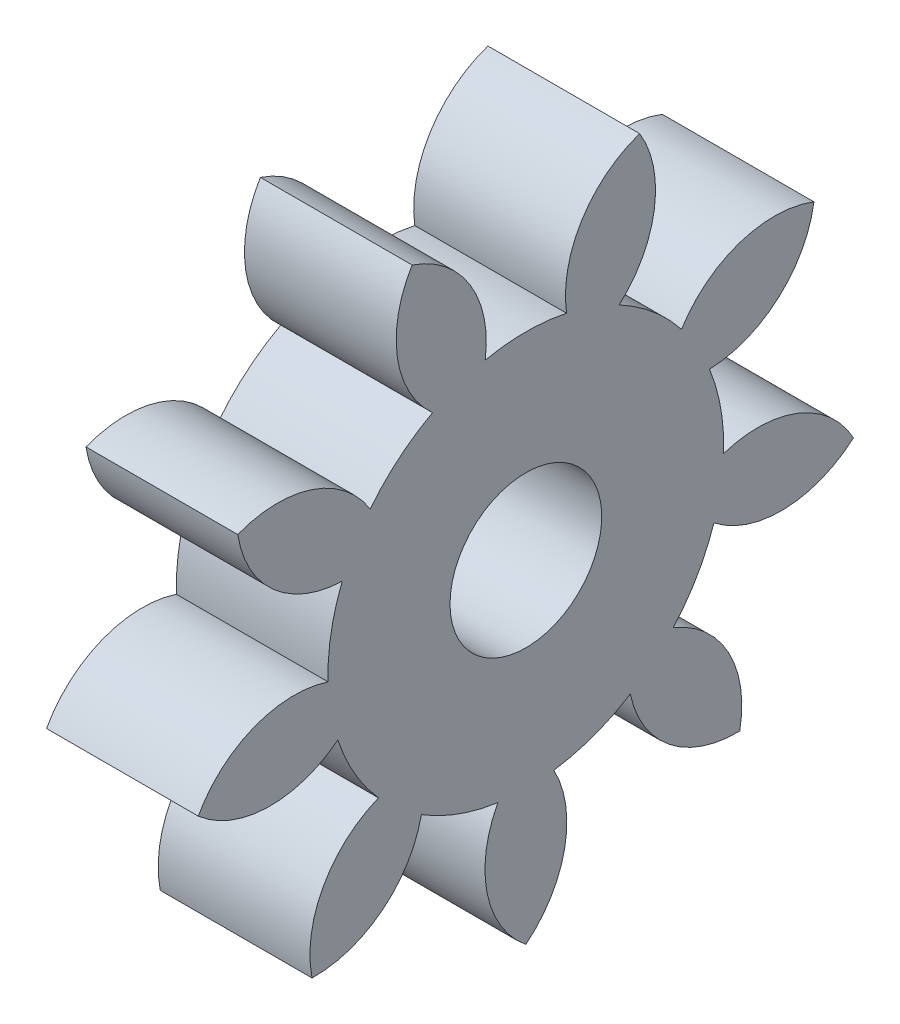
ISO-10303-21;
HEADER;
FILE_DESCRIPTION(('STEP AP214'),'2;1');
FILE_NAME('part.step','',(''),(''),'','','');
FILE_SCHEMA(('AUTOMOTIVE_DESIGN { 1 0 10303 214 1 1 1 1 }'));
ENDSEC;
DATA;
#1=APPLICATION_CONTEXT('core data for automotive mechanical design processes');
#2=APPLICATION_PROTOCOL_DEFINITION('international standard','automotive_design',2000,#1);
#3=PRODUCT_CONTEXT('',#1,'mechanical');
#4=PRODUCT('Part','Part','',(#3));
#5=PRODUCT_RELATED_PRODUCT_CATEGORY('part','',(#4));
#6=PRODUCT_DEFINITION_FORMATION('','',#4);
#7=PRODUCT_DEFINITION_CONTEXT('part definition',#1,'design');
#8=PRODUCT_DEFINITION('design','',#6,#7);
#9=PRODUCT_DEFINITION_SHAPE('','',#8);
#10=(LENGTH_UNIT() NAMED_UNIT(*) SI_UNIT(.MILLI.,.METRE.));
#11=(NAMED_UNIT(*) PLANE_ANGLE_UNIT() SI_UNIT($,.RADIAN.));
#12=(NAMED_UNIT(*) SI_UNIT($,.STERADIAN.) SOLID_ANGLE_UNIT());
#13=UNCERTAINTY_MEASURE_WITH_UNIT(LENGTH_MEASURE(1.E-05),#10,'distance_accuracy_value','');
#14=(GEOMETRIC_REPRESENTATION_CONTEXT(3) GLOBAL_UNCERTAINTY_ASSIGNED_CONTEXT((#13)) GLOBAL_UNIT_ASSIGNED_CONTEXT((#10,
#11,#12)) REPRESENTATION_CONTEXT('',''));
#15=CARTESIAN_POINT('',(0.,0.,0.));
#16=DIRECTION('',(0.,0.,1.));
#17=DIRECTION('',(1.,0.,0.));
#18=AXIS2_PLACEMENT_3D('',#15,#16,#17);
#19=CARTESIAN_POINT('',(3.175,0.,0.));
#20=DIRECTION('',(-1.,0.,0.));
#21=DIRECTION('',(0.,0.,1.));
#22=AXIS2_PLACEMENT_3D('',#19,#20,#21);
#23=PLANE('',#22);
#24=CARTESIAN_POINT('',(3.175,5.35333295209364,0.427099251646094));
#25=DIRECTION('',(-1.,0.,0.));
#26=DIRECTION('',(0.,0.642787609686541,-0.766044443118977));
#27=AXIS2_PLACEMENT_3D('',#24,#25,#26);
#28=CIRCLE('',#27,2.286);
#29=CARTESIAN_POINT('',(3.175,3.65082029361267,1.95263084676698));
#30=VERTEX_POINT('',#29);
#31=CARTESIAN_POINT('',(3.175,6.54062407727787,2.380592477654));
#32=VERTEX_POINT('',#31);
#33=EDGE_CURVE('E49',#30,#32,#28,.T.);
#34=ORIENTED_EDGE('',*,*,#33,.F.);
#35=CARTESIAN_POINT('',(3.175,0.,0.));
#36=DIRECTION('',(-1.,0.,0.));
#37=DIRECTION('',(0.,0.642787609686541,-0.766044443118977));
#38=AXIS2_PLACEMENT_3D('',#35,#36,#37);
#39=CIRCLE('',#38,4.1402);
#40=CARTESIAN_POINT('',(3.175,2.55692428764219,3.25628534180675));
#41=VERTEX_POINT('',#40);
#42=EDGE_CURVE('E272',#41,#30,#39,.T.);
#43=ORIENTED_EDGE('',*,*,#42,.F.);
#44=CARTESIAN_POINT('',(3.175,1.35020716590216,5.19783878894629));
#45=DIRECTION('',(-1.,0.,0.));
#46=DIRECTION('',(0.,0.642787609686541,-0.766044443118977));
#47=AXIS2_PLACEMENT_3D('',#44,#45,#46);
#48=CIRCLE('',#47,2.286);
#49=CARTESIAN_POINT('',(3.175,3.48019338057993,6.02787175532935));
#50=VERTEX_POINT('',#49);
#51=EDGE_CURVE('E428',#50,#41,#48,.T.);
#52=ORIENTED_EDGE('',*,*,#51,.F.);
#53=CARTESIAN_POINT('',(3.175,3.82635685305253,3.76823310051622));
#54=DIRECTION('',(-1.,0.,0.));
#55=DIRECTION('',(0.,0.984807753012209,-0.173648177666927));
#56=AXIS2_PLACEMENT_3D('',#53,#54,#55);
#57=CIRCLE('',#56,2.286);
#58=CARTESIAN_POINT('',(3.175,1.54156368415443,3.84250405955495));
#59=VERTEX_POINT('',#58);
#60=EDGE_CURVE('E408',#59,#50,#57,.T.);
#61=ORIENTED_EDGE('',*,*,#60,.F.);
#62=CARTESIAN_POINT('',(3.175,0.,0.));
#63=DIRECTION('',(-1.,0.,0.));
#64=DIRECTION('',(0.,0.984807753012209,-0.173648177666927));
#65=AXIS2_PLACEMENT_3D('',#62,#63,#64);
#66=CIRCLE('',#65,4.1402);
#67=CARTESIAN_POINT('',(3.175,-0.13438222929303,4.13801854230382));
#68=VERTEX_POINT('',#67);
#69=EDGE_CURVE('E414',#68,#59,#66,.T.);
#70=ORIENTED_EDGE('',*,*,#69,.F.);
#71=CARTESIAN_POINT('',(3.175,-2.306787674184,4.84967195725247));
#72=DIRECTION('',(-1.,0.,0.));
#73=DIRECTION('',(0.,0.984807753012209,-0.173648177666927));
#74=AXIS2_PLACEMENT_3D('',#71,#72,#73);
#75=CIRCLE('',#74,2.286);
#76=CARTESIAN_POINT('',(3.175,-1.20865847693247,6.85464284635378));
#77=VERTEX_POINT('',#76);
#78=EDGE_CURVE('E411',#77,#68,#75,.T.);
#79=ORIENTED_EDGE('',*,*,#78,.F.);
#80=CARTESIAN_POINT('',(3.175,0.508985857248586,5.3461688024088));
#81=DIRECTION('',(-1.,0.,0.));
#82=DIRECTION('',(0.,0.866025403784436,0.500000000000004));
#83=AXIS2_PLACEMENT_3D('',#80,#81,#82);
#84=CIRCLE('',#83,2.286);
#85=CARTESIAN_POINT('',(3.175,-1.28900770569164,3.93442691820138));
#86=VERTEX_POINT('',#85);
#87=EDGE_CURVE('E386',#86,#77,#84,.T.);
#88=ORIENTED_EDGE('',*,*,#87,.F.);
#89=CARTESIAN_POINT('',(3.175,0.,0.));
#90=DIRECTION('',(-1.,0.,0.));
#91=DIRECTION('',(0.,0.866025403784436,0.500000000000004));
#92=AXIS2_PLACEMENT_3D('',#89,#90,#91);
#93=CIRCLE('',#92,4.1402);
#94=CARTESIAN_POINT('',(3.175,-2.76280980764992,3.08352687790352));
#95=VERTEX_POINT('',#94);
#96=EDGE_CURVE('E392',#95,#86,#93,.T.);
#97=ORIENTED_EDGE('',*,*,#96,.F.);
#98=CARTESIAN_POINT('',(3.175,-4.88441092443016,2.23228971866008));
#99=DIRECTION('',(-1.,0.,0.));
#100=DIRECTION('',(0.,0.866025403784436,0.500000000000004));
#101=AXIS2_PLACEMENT_3D('',#98,#99,#100);
#102=CIRCLE('',#101,2.286);
#103=CARTESIAN_POINT('',(3.175,-5.33196560034545,4.47405036869977));
#104=VERTEX_POINT('',#103);
#105=EDGE_CURVE('E389',#104,#95,#102,.T.);
#106=ORIENTED_EDGE('',*,*,#105,.F.);
#107=CARTESIAN_POINT('',(3.175,-3.04654527790968,4.42257270560637));
#108=DIRECTION('',(-1.,0.,0.));
#109=DIRECTION('',(0.,0.342020143325663,0.939692620785911));
#110=AXIS2_PLACEMENT_3D('',#107,#108,#109);
#111=CIRCLE('',#110,2.286);
#112=CARTESIAN_POINT('',(3.175,-3.51643806431967,2.18538769553683));
#113=VERTEX_POINT('',#112);
#114=EDGE_CURVE('E364',#113,#104,#111,.T.);
#115=ORIENTED_EDGE('',*,*,#114,.F.);
#116=CARTESIAN_POINT('',(3.175,0.,0.));
#117=DIRECTION('',(-1.,0.,0.));
#118=DIRECTION('',(0.,0.342020143325663,0.939692620785911));
#119=AXIS2_PLACEMENT_3D('',#116,#117,#118);
#120=CIRCLE('',#119,4.1402);
#121=CARTESIAN_POINT('',(3.175,-4.09848797179663,0.586218717748173));
#122=VERTEX_POINT('',#121);
#123=EDGE_CURVE('E370',#122,#113,#120,.T.);
#124=ORIENTED_EDGE('',*,*,#123,.F.);
#125=CARTESIAN_POINT('',(3.175,-5.1765640189547,-1.42960568843011));
#126=DIRECTION('',(-1.,0.,0.));
#127=DIRECTION('',(0.,0.342020143325663,0.939692620785911));
#128=AXIS2_PLACEMENT_3D('',#125,#126,#127);
#129=CIRCLE('',#128,2.286);
#130=CARTESIAN_POINT('',(3.175,-6.96038676115988,0.));
#131=VERTEX_POINT('',#130);
#132=EDGE_CURVE('E367',#131,#122,#129,.T.);
#133=ORIENTED_EDGE('',*,*,#132,.F.);
#134=CARTESIAN_POINT('',(3.175,-5.17656401895472,1.42960568843004));
#135=DIRECTION('',(-1.,0.,0.));
#136=DIRECTION('',(0.,-0.342020143325676,0.939692620785906));
#137=AXIS2_PLACEMENT_3D('',#134,#135,#136);
#138=CIRCLE('',#137,2.286);
#139=CARTESIAN_POINT('',(3.175,-4.09848797179663,-0.586218717748228));
#140=VERTEX_POINT('',#139);
#141=EDGE_CURVE('E342',#140,#131,#138,.T.);
#142=ORIENTED_EDGE('',*,*,#141,.F.);
#143=CARTESIAN_POINT('',(3.175,0.,0.));
#144=DIRECTION('',(-1.,0.,0.));
#145=DIRECTION('',(0.,-0.342020143325676,0.939692620785906));
#146=AXIS2_PLACEMENT_3D('',#143,#144,#145);
#147=CIRCLE('',#146,4.1402);
#148=CARTESIAN_POINT('',(3.175,-3.51643806431964,-2.18538769553688));
#149=VERTEX_POINT('',#148);
#150=EDGE_CURVE('E348',#149,#140,#147,.T.);
#151=ORIENTED_EDGE('',*,*,#150,.F.);
#152=CARTESIAN_POINT('',(3.175,-3.04654527790962,-4.42257270560641));
#153=DIRECTION('',(-1.,0.,0.));
#154=DIRECTION('',(0.,-0.342020143325676,0.939692620785906));
#155=AXIS2_PLACEMENT_3D('',#152,#153,#154);
#156=CIRCLE('',#155,2.286);
#157=CARTESIAN_POINT('',(3.175,-5.33196560034539,-4.47405036869984));
#158=VERTEX_POINT('',#157);
#159=EDGE_CURVE('E345',#158,#149,#156,.T.);
#160=ORIENTED_EDGE('',*,*,#159,.F.);
#161=CARTESIAN_POINT('',(3.175,-4.88441092443013,-2.23228971866015));
#162=DIRECTION('',(-1.,0.,0.));
#163=DIRECTION('',(0.,-0.866025403784443,0.499999999999992));
#164=AXIS2_PLACEMENT_3D('',#161,#162,#163);
#165=CIRCLE('',#164,2.286);
#166=CARTESIAN_POINT('',(3.175,-2.76280980764988,-3.08352687790355));
#167=VERTEX_POINT('',#166);
#168=EDGE_CURVE('E320',#167,#158,#165,.T.);
#169=ORIENTED_EDGE('',*,*,#168,.F.);
#170=CARTESIAN_POINT('',(3.175,0.,0.));
#171=DIRECTION('',(-1.,0.,0.));
#172=DIRECTION('',(0.,-0.866025403784443,0.499999999999992));
#173=AXIS2_PLACEMENT_3D('',#170,#171,#172);
#174=CIRCLE('',#173,4.1402);
#175=CARTESIAN_POINT('',(3.175,-1.28900770569158,-3.93442691820139));
#176=VERTEX_POINT('',#175);
#177=EDGE_CURVE('E326',#176,#167,#174,.T.);
#178=ORIENTED_EDGE('',*,*,#177,.F.);
#179=CARTESIAN_POINT('',(3.175,0.508985857248661,-5.34616880240879));
#180=DIRECTION('',(-1.,0.,0.));
#181=DIRECTION('',(0.,-0.866025403784443,0.499999999999992));
#182=AXIS2_PLACEMENT_3D('',#179,#180,#181);
#183=CIRCLE('',#182,2.286);
#184=CARTESIAN_POINT('',(3.175,-1.20865847693237,-6.85464284635379));
#185=VERTEX_POINT('',#184);
#186=EDGE_CURVE('E323',#185,#176,#183,.T.);
#187=ORIENTED_EDGE('',*,*,#186,.F.);
#188=CARTESIAN_POINT('',(3.175,-2.30678767418394,-4.8496719572525));
#189=DIRECTION('',(-1.,0.,0.));
#190=DIRECTION('',(0.,-0.984807753012206,-0.17364817766694));
#191=AXIS2_PLACEMENT_3D('',#188,#189,#190);
#192=CIRCLE('',#191,2.286);
#193=CARTESIAN_POINT('',(3.175,-0.134382229292976,-4.13801854230382));
#194=VERTEX_POINT('',#193);
#195=EDGE_CURVE('E298',#194,#185,#192,.T.);
#196=ORIENTED_EDGE('',*,*,#195,.F.);
#197=CARTESIAN_POINT('',(3.175,0.,0.));
#198=DIRECTION('',(-1.,0.,0.));
#199=DIRECTION('',(0.,-0.984807753012206,-0.17364817766694));
#200=AXIS2_PLACEMENT_3D('',#197,#198,#199);
#201=CIRCLE('',#200,4.1402);
#202=CARTESIAN_POINT('',(3.175,1.54156368415448,-3.84250405955492));
#203=VERTEX_POINT('',#202);
#204=EDGE_CURVE('E304',#203,#194,#201,.T.);
#205=ORIENTED_EDGE('',*,*,#204,.F.);
#206=CARTESIAN_POINT('',(3.175,3.82635685305259,-3.76823310051617));
#207=DIRECTION('',(-1.,0.,0.));
#208=DIRECTION('',(0.,-0.984807753012206,-0.17364817766694));
#209=AXIS2_PLACEMENT_3D('',#206,#207,#208);
#210=CIRCLE('',#209,2.286);
#211=CARTESIAN_POINT('',(3.175,3.48019338058001,-6.02787175532931));
#212=VERTEX_POINT('',#211);
#213=EDGE_CURVE('E301',#212,#203,#210,.T.);
#214=ORIENTED_EDGE('',*,*,#213,.F.);
#215=CARTESIAN_POINT('',(3.175,1.35020716590223,-5.19783878894628));
#216=DIRECTION('',(-1.,0.,0.));
#217=DIRECTION('',(0.,-0.64278760968653,-0.766044443118986));
#218=AXIS2_PLACEMENT_3D('',#215,#216,#217);
#219=CIRCLE('',#218,2.286);
#220=CARTESIAN_POINT('',(3.175,2.55692428764223,-3.25628534180671));
#221=VERTEX_POINT('',#220);
#222=EDGE_CURVE('E283',#221,#212,#219,.T.);
#223=ORIENTED_EDGE('',*,*,#222,.F.);
#224=CARTESIAN_POINT('',(3.175,0.,0.));
#225=DIRECTION('',(-1.,0.,0.));
#226=DIRECTION('',(0.,-0.64278760968653,-0.766044443118986));
#227=AXIS2_PLACEMENT_3D('',#224,#225,#226);
#228=CIRCLE('',#227,4.1402);
#229=CARTESIAN_POINT('',(3.175,3.65082029361269,-1.95263084676693));
#230=VERTEX_POINT('',#229);
#231=EDGE_CURVE('E282',#230,#221,#228,.T.);
#232=ORIENTED_EDGE('',*,*,#231,.F.);
#233=CARTESIAN_POINT('',(3.175,5.35333295209364,-0.427099251646021));
#234=DIRECTION('',(-1.,0.,0.));
#235=DIRECTION('',(0.,-0.64278760968653,-0.766044443118986));
#236=AXIS2_PLACEMENT_3D('',#233,#234,#235);
#237=CIRCLE('',#236,2.286);
#238=CARTESIAN_POINT('',(3.175,6.54062407727785,-2.38059247765394));
#239=VERTEX_POINT('',#238);
#240=EDGE_CURVE('E280',#239,#230,#237,.T.);
#241=ORIENTED_EDGE('',*,*,#240,.F.);
#242=CARTESIAN_POINT('',(3.175,4.37542506718154,-3.11387908374869));
#243=DIRECTION('',(-1.,0.,0.));
#244=DIRECTION('',(0.,0.,-1.));
#245=AXIS2_PLACEMENT_3D('',#242,#243,#244);
#246=CIRCLE('',#245,2.286);
#247=CARTESIAN_POINT('',(3.175,4.05181751334153,-0.850900040297855));
#248=VERTEX_POINT('',#247);
#249=EDGE_CURVE('E230',#248,#239,#246,.T.);
#250=ORIENTED_EDGE('',*,*,#249,.F.);
#251=CARTESIAN_POINT('',(3.175,0.,0.));
#252=DIRECTION('',(-1.,0.,0.));
#253=DIRECTION('',(0.,0.,-1.));
#254=AXIS2_PLACEMENT_3D('',#251,#252,#253);
#255=CIRCLE('',#254,4.1402);
#256=CARTESIAN_POINT('',(3.175,4.05181751334153,0.850900040297854));
#257=VERTEX_POINT('',#256);
#258=EDGE_CURVE('E246',#257,#248,#255,.T.);
#259=ORIENTED_EDGE('',*,*,#258,.F.);
#260=CARTESIAN_POINT('',(3.175,4.37542506718154,3.11387908374869));
#261=DIRECTION('',(-1.,0.,0.));
#262=DIRECTION('',(0.,0.,-1.));
#263=AXIS2_PLACEMENT_3D('',#260,#261,#262);
#264=CIRCLE('',#263,2.286);
#265=EDGE_CURVE('E255',#32,#257,#264,.T.);
#266=ORIENTED_EDGE('',*,*,#265,.F.);
#267=EDGE_LOOP('',(#34,#43,#52,#61,#70,#79,#88,#97,#106,#115,#124,#133,#142,#151,#160,#169,#178,
#187,#196,#205,#214,#223,#232,#241,#250,#259,#266));
#268=FACE_BOUND('',#267,.T.);
#269=CARTESIAN_POINT('',(3.175,0.,0.));
#270=DIRECTION('',(-1.,0.,0.));
#271=DIRECTION('',(0.,0.,1.));
#272=AXIS2_PLACEMENT_3D('',#269,#270,#271);
#273=CIRCLE('',#272,1.5875);
#274=CARTESIAN_POINT('',(3.175,0.,1.5875));
#275=VERTEX_POINT('',#274);
#276=EDGE_CURVE('E231',#275,#275,#273,.F.);
#277=ORIENTED_EDGE('',*,*,#276,.F.);
#278=EDGE_LOOP('',(#277));
#279=FACE_BOUND('',#278,.T.);
#280=ADVANCED_FACE('F34',(#268,#279),#23,.F.);
#281=CARTESIAN_POINT('',(0.,0.,0.));
#282=DIRECTION('',(1.,0.,0.));
#283=DIRECTION('',(0.,0.,-1.));
#284=AXIS2_PLACEMENT_3D('',#281,#282,#283);
#285=PLANE('',#284);
#286=CARTESIAN_POINT('',(0.,5.35333295209364,0.427099251646094));
#287=DIRECTION('',(-1.,0.,0.));
#288=DIRECTION('',(0.,0.642787609686541,-0.766044443118977));
#289=AXIS2_PLACEMENT_3D('',#286,#287,#288);
#290=CIRCLE('',#289,2.286);
#291=CARTESIAN_POINT('',(0.,3.65082029361267,1.95263084676698));
#292=VERTEX_POINT('',#291);
#293=CARTESIAN_POINT('',(0.,6.54062407727787,2.380592477654));
#294=VERTEX_POINT('',#293);
#295=EDGE_CURVE('E261',#292,#294,#290,.T.);
#296=ORIENTED_EDGE('',*,*,#295,.T.);
#297=CARTESIAN_POINT('',(0.,4.37542506718154,3.11387908374869));
#298=DIRECTION('',(1.,0.,0.));
#299=DIRECTION('',(0.,0.,-1.));
#300=AXIS2_PLACEMENT_3D('',#297,#298,#299);
#301=CIRCLE('',#300,2.286);
#302=CARTESIAN_POINT('',(0.,4.05181751334153,0.850900040297854));
#303=VERTEX_POINT('',#302);
#304=EDGE_CURVE('E11',#303,#294,#301,.T.);
#305=ORIENTED_EDGE('',*,*,#304,.F.);
#306=CARTESIAN_POINT('',(0.,0.,0.));
#307=DIRECTION('',(-1.,0.,0.));
#308=DIRECTION('',(0.,0.,-1.));
#309=AXIS2_PLACEMENT_3D('',#306,#307,#308);
#310=CIRCLE('',#309,4.1402);
#311=CARTESIAN_POINT('',(0.,4.05181751334153,-0.850900040297855));
#312=VERTEX_POINT('',#311);
#313=EDGE_CURVE('E239',#303,#312,#310,.T.);
#314=ORIENTED_EDGE('',*,*,#313,.T.);
#315=CARTESIAN_POINT('',(0.,4.37542506718154,-3.11387908374869));
#316=DIRECTION('',(-1.,0.,0.));
#317=DIRECTION('',(0.,0.,-1.));
#318=AXIS2_PLACEMENT_3D('',#315,#316,#317);
#319=CIRCLE('',#318,2.286);
#320=CARTESIAN_POINT('',(0.,6.54062407727785,-2.38059247765394));
#321=VERTEX_POINT('',#320);
#322=EDGE_CURVE('E57',#312,#321,#319,.T.);
#323=ORIENTED_EDGE('',*,*,#322,.T.);
#324=CARTESIAN_POINT('',(0.,5.35333295209364,-0.427099251646021));
#325=DIRECTION('',(-1.,0.,0.));
#326=DIRECTION('',(0.,-0.64278760968653,-0.766044443118986));
#327=AXIS2_PLACEMENT_3D('',#324,#325,#326);
#328=CIRCLE('',#327,2.286);
#329=CARTESIAN_POINT('',(0.,3.65082029361269,-1.95263084676693));
#330=VERTEX_POINT('',#329);
#331=EDGE_CURVE('E215',#321,#330,#328,.T.);
#332=ORIENTED_EDGE('',*,*,#331,.T.);
#333=CARTESIAN_POINT('',(0.,0.,0.));
#334=DIRECTION('',(-1.,0.,0.));
#335=DIRECTION('',(0.,-0.64278760968653,-0.766044443118986));
#336=AXIS2_PLACEMENT_3D('',#333,#334,#335);
#337=CIRCLE('',#336,4.1402);
#338=CARTESIAN_POINT('',(0.,2.55692428764223,-3.25628534180671));
#339=VERTEX_POINT('',#338);
#340=EDGE_CURVE('E224',#330,#339,#337,.T.);
#341=ORIENTED_EDGE('',*,*,#340,.T.);
#342=CARTESIAN_POINT('',(0.,1.35020716590223,-5.19783878894628));
#343=DIRECTION('',(-1.,0.,0.));
#344=DIRECTION('',(0.,-0.64278760968653,-0.766044443118986));
#345=AXIS2_PLACEMENT_3D('',#342,#343,#344);
#346=CIRCLE('',#345,2.286);
#347=CARTESIAN_POINT('',(0.,3.48019338058001,-6.02787175532931));
#348=VERTEX_POINT('',#347);
#349=EDGE_CURVE('E225',#339,#348,#346,.T.);
#350=ORIENTED_EDGE('',*,*,#349,.T.);
#351=CARTESIAN_POINT('',(0.,3.82635685305259,-3.76823310051617));
#352=DIRECTION('',(-1.,0.,0.));
#353=DIRECTION('',(0.,-0.984807753012206,-0.17364817766694));
#354=AXIS2_PLACEMENT_3D('',#351,#352,#353);
#355=CIRCLE('',#354,2.286);
#356=CARTESIAN_POINT('',(0.,1.54156368415448,-3.84250405955492));
#357=VERTEX_POINT('',#356);
#358=EDGE_CURVE('E309',#348,#357,#355,.T.);
#359=ORIENTED_EDGE('',*,*,#358,.T.);
#360=CARTESIAN_POINT('',(0.,0.,0.));
#361=DIRECTION('',(-1.,0.,0.));
#362=DIRECTION('',(0.,-0.984807753012206,-0.17364817766694));
#363=AXIS2_PLACEMENT_3D('',#360,#361,#362);
#364=CIRCLE('',#363,4.1402);
#365=CARTESIAN_POINT('',(0.,-0.134382229292976,-4.13801854230382));
#366=VERTEX_POINT('',#365);
#367=EDGE_CURVE('E302',#357,#366,#364,.T.);
#368=ORIENTED_EDGE('',*,*,#367,.T.);
#369=CARTESIAN_POINT('',(0.,-2.30678767418394,-4.8496719572525));
#370=DIRECTION('',(-1.,0.,0.));
#371=DIRECTION('',(0.,-0.984807753012206,-0.17364817766694));
#372=AXIS2_PLACEMENT_3D('',#369,#370,#371);
#373=CIRCLE('',#372,2.286);
#374=CARTESIAN_POINT('',(0.,-1.20865847693237,-6.85464284635379));
#375=VERTEX_POINT('',#374);
#376=EDGE_CURVE('E297',#366,#375,#373,.T.);
#377=ORIENTED_EDGE('',*,*,#376,.T.);
#378=CARTESIAN_POINT('',(0.,0.508985857248661,-5.34616880240879));
#379=DIRECTION('',(-1.,0.,0.));
#380=DIRECTION('',(0.,-0.866025403784443,0.499999999999992));
#381=AXIS2_PLACEMENT_3D('',#378,#379,#380);
#382=CIRCLE('',#381,2.286);
#383=CARTESIAN_POINT('',(0.,-1.28900770569158,-3.93442691820139));
#384=VERTEX_POINT('',#383);
#385=EDGE_CURVE('E331',#375,#384,#382,.T.);
#386=ORIENTED_EDGE('',*,*,#385,.T.);
#387=CARTESIAN_POINT('',(0.,0.,0.));
#388=DIRECTION('',(-1.,0.,0.));
#389=DIRECTION('',(0.,-0.866025403784443,0.499999999999992));
#390=AXIS2_PLACEMENT_3D('',#387,#388,#389);
#391=CIRCLE('',#390,4.1402);
#392=CARTESIAN_POINT('',(0.,-2.76280980764988,-3.08352687790355));
#393=VERTEX_POINT('',#392);
#394=EDGE_CURVE('E324',#384,#393,#391,.T.);
#395=ORIENTED_EDGE('',*,*,#394,.T.);
#396=CARTESIAN_POINT('',(0.,-4.88441092443013,-2.23228971866015));
#397=DIRECTION('',(-1.,0.,0.));
#398=DIRECTION('',(0.,-0.866025403784443,0.499999999999992));
#399=AXIS2_PLACEMENT_3D('',#396,#397,#398);
#400=CIRCLE('',#399,2.286);
#401=CARTESIAN_POINT('',(0.,-5.33196560034539,-4.47405036869984));
#402=VERTEX_POINT('',#401);
#403=EDGE_CURVE('E319',#393,#402,#400,.T.);
#404=ORIENTED_EDGE('',*,*,#403,.T.);
#405=CARTESIAN_POINT('',(0.,-3.04654527790962,-4.42257270560641));
#406=DIRECTION('',(-1.,0.,0.));
#407=DIRECTION('',(0.,-0.342020143325676,0.939692620785906));
#408=AXIS2_PLACEMENT_3D('',#405,#406,#407);
#409=CIRCLE('',#408,2.286);
#410=CARTESIAN_POINT('',(0.,-3.51643806431964,-2.18538769553688));
#411=VERTEX_POINT('',#410);
#412=EDGE_CURVE('E353',#402,#411,#409,.T.);
#413=ORIENTED_EDGE('',*,*,#412,.T.);
#414=CARTESIAN_POINT('',(0.,0.,0.));
#415=DIRECTION('',(-1.,0.,0.));
#416=DIRECTION('',(0.,-0.342020143325676,0.939692620785906));
#417=AXIS2_PLACEMENT_3D('',#414,#415,#416);
#418=CIRCLE('',#417,4.1402);
#419=CARTESIAN_POINT('',(0.,-4.09848797179663,-0.586218717748228));
#420=VERTEX_POINT('',#419);
#421=EDGE_CURVE('E346',#411,#420,#418,.T.);
#422=ORIENTED_EDGE('',*,*,#421,.T.);
#423=CARTESIAN_POINT('',(0.,-5.17656401895472,1.42960568843004));
#424=DIRECTION('',(-1.,0.,0.));
#425=DIRECTION('',(0.,-0.342020143325676,0.939692620785906));
#426=AXIS2_PLACEMENT_3D('',#423,#424,#425);
#427=CIRCLE('',#426,2.286);
#428=CARTESIAN_POINT('',(0.,-6.96038676115988,0.));
#429=VERTEX_POINT('',#428);
#430=EDGE_CURVE('E341',#420,#429,#427,.T.);
#431=ORIENTED_EDGE('',*,*,#430,.T.);
#432=CARTESIAN_POINT('',(0.,-5.1765640189547,-1.42960568843011));
#433=DIRECTION('',(-1.,0.,0.));
#434=DIRECTION('',(0.,0.342020143325663,0.939692620785911));
#435=AXIS2_PLACEMENT_3D('',#432,#433,#434);
#436=CIRCLE('',#435,2.286);
#437=CARTESIAN_POINT('',(0.,-4.09848797179663,0.586218717748173));
#438=VERTEX_POINT('',#437);
#439=EDGE_CURVE('E375',#429,#438,#436,.T.);
#440=ORIENTED_EDGE('',*,*,#439,.T.);
#441=CARTESIAN_POINT('',(0.,0.,0.));
#442=DIRECTION('',(-1.,0.,0.));
#443=DIRECTION('',(0.,0.342020143325663,0.939692620785911));
#444=AXIS2_PLACEMENT_3D('',#441,#442,#443);
#445=CIRCLE('',#444,4.1402);
#446=CARTESIAN_POINT('',(0.,-3.51643806431967,2.18538769553683));
#447=VERTEX_POINT('',#446);
#448=EDGE_CURVE('E368',#438,#447,#445,.T.);
#449=ORIENTED_EDGE('',*,*,#448,.T.);
#450=CARTESIAN_POINT('',(0.,-3.04654527790968,4.42257270560637));
#451=DIRECTION('',(-1.,0.,0.));
#452=DIRECTION('',(0.,0.342020143325663,0.939692620785911));
#453=AXIS2_PLACEMENT_3D('',#450,#451,#452);
#454=CIRCLE('',#453,2.286);
#455=CARTESIAN_POINT('',(0.,-5.33196560034545,4.47405036869977));
#456=VERTEX_POINT('',#455);
#457=EDGE_CURVE('E363',#447,#456,#454,.T.);
#458=ORIENTED_EDGE('',*,*,#457,.T.);
#459=CARTESIAN_POINT('',(0.,-4.88441092443016,2.23228971866008));
#460=DIRECTION('',(-1.,0.,0.));
#461=DIRECTION('',(0.,0.866025403784436,0.500000000000004));
#462=AXIS2_PLACEMENT_3D('',#459,#460,#461);
#463=CIRCLE('',#462,2.286);
#464=CARTESIAN_POINT('',(0.,-2.76280980764992,3.08352687790352));
#465=VERTEX_POINT('',#464);
#466=EDGE_CURVE('E397',#456,#465,#463,.T.);
#467=ORIENTED_EDGE('',*,*,#466,.T.);
#468=CARTESIAN_POINT('',(0.,0.,0.));
#469=DIRECTION('',(-1.,0.,0.));
#470=DIRECTION('',(0.,0.866025403784436,0.500000000000004));
#471=AXIS2_PLACEMENT_3D('',#468,#469,#470);
#472=CIRCLE('',#471,4.1402);
#473=CARTESIAN_POINT('',(0.,-1.28900770569164,3.93442691820138));
#474=VERTEX_POINT('',#473);
#475=EDGE_CURVE('E390',#465,#474,#472,.T.);
#476=ORIENTED_EDGE('',*,*,#475,.T.);
#477=CARTESIAN_POINT('',(0.,0.508985857248586,5.3461688024088));
#478=DIRECTION('',(-1.,0.,0.));
#479=DIRECTION('',(0.,0.866025403784436,0.500000000000004));
#480=AXIS2_PLACEMENT_3D('',#477,#478,#479);
#481=CIRCLE('',#480,2.286);
#482=CARTESIAN_POINT('',(0.,-1.20865847693247,6.85464284635378));
#483=VERTEX_POINT('',#482);
#484=EDGE_CURVE('E385',#474,#483,#481,.T.);
#485=ORIENTED_EDGE('',*,*,#484,.T.);
#486=CARTESIAN_POINT('',(0.,-2.306787674184,4.84967195725247));
#487=DIRECTION('',(-1.,0.,0.));
#488=DIRECTION('',(0.,0.984807753012209,-0.173648177666927));
#489=AXIS2_PLACEMENT_3D('',#486,#487,#488);
#490=CIRCLE('',#489,2.286);
#491=CARTESIAN_POINT('',(0.,-0.13438222929303,4.13801854230382));
#492=VERTEX_POINT('',#491);
#493=EDGE_CURVE('E419',#483,#492,#490,.T.);
#494=ORIENTED_EDGE('',*,*,#493,.T.);
#495=CARTESIAN_POINT('',(0.,0.,0.));
#496=DIRECTION('',(-1.,0.,0.));
#497=DIRECTION('',(0.,0.984807753012209,-0.173648177666927));
#498=AXIS2_PLACEMENT_3D('',#495,#496,#497);
#499=CIRCLE('',#498,4.1402);
#500=CARTESIAN_POINT('',(0.,1.54156368415443,3.84250405955495));
#501=VERTEX_POINT('',#500);
#502=EDGE_CURVE('E412',#492,#501,#499,.T.);
#503=ORIENTED_EDGE('',*,*,#502,.T.);
#504=CARTESIAN_POINT('',(0.,3.82635685305253,3.76823310051622));
#505=DIRECTION('',(-1.,0.,0.));
#506=DIRECTION('',(0.,0.984807753012209,-0.173648177666927));
#507=AXIS2_PLACEMENT_3D('',#504,#505,#506);
#508=CIRCLE('',#507,2.286);
#509=CARTESIAN_POINT('',(0.,3.48019338057993,6.02787175532936));
#510=VERTEX_POINT('',#509);
#511=EDGE_CURVE('E407',#501,#510,#508,.T.);
#512=ORIENTED_EDGE('',*,*,#511,.T.);
#513=CARTESIAN_POINT('',(0.,1.35020716590216,5.19783878894629));
#514=DIRECTION('',(-1.,0.,0.));
#515=DIRECTION('',(0.,0.642787609686541,-0.766044443118977));
#516=AXIS2_PLACEMENT_3D('',#513,#514,#515);
#517=CIRCLE('',#516,2.286);
#518=CARTESIAN_POINT('',(0.,2.55692428764219,3.25628534180675));
#519=VERTEX_POINT('',#518);
#520=EDGE_CURVE('E265',#510,#519,#517,.T.);
#521=ORIENTED_EDGE('',*,*,#520,.T.);
#522=CARTESIAN_POINT('',(0.,0.,0.));
#523=DIRECTION('',(-1.,0.,0.));
#524=DIRECTION('',(0.,0.642787609686541,-0.766044443118977));
#525=AXIS2_PLACEMENT_3D('',#522,#523,#524);
#526=CIRCLE('',#525,4.1402);
#527=EDGE_CURVE('E264',#519,#292,#526,.T.);
#528=ORIENTED_EDGE('',*,*,#527,.T.);
#529=EDGE_LOOP('',(#296,#305,#314,#323,#332,#341,#350,#359,#368,#377,#386,#395,#404,#413,#422,
#431,#440,#449,#458,#467,#476,#485,#494,#503,#512,#521,#528));
#530=FACE_BOUND('',#529,.T.);
#531=CARTESIAN_POINT('',(0.,0.,0.));
#532=DIRECTION('',(1.,0.,0.));
#533=DIRECTION('',(0.,0.,-1.));
#534=AXIS2_PLACEMENT_3D('',#531,#532,#533);
#535=CIRCLE('',#534,1.5875);
#536=CARTESIAN_POINT('',(0.,0.,-1.5875));
#537=VERTEX_POINT('',#536);
#538=EDGE_CURVE('E37',#537,#537,#535,.F.);
#539=ORIENTED_EDGE('',*,*,#538,.F.);
#540=EDGE_LOOP('',(#539));
#541=FACE_BOUND('',#540,.T.);
#542=ADVANCED_FACE('F235',(#530,#541),#285,.F.);
#543=CARTESIAN_POINT('',(3.175,4.37542506718154,-3.11387908374869));
#544=DIRECTION('',(-1.,0.,0.));
#545=DIRECTION('',(0.,0.,1.));
#546=AXIS2_PLACEMENT_3D('',#543,#544,#545);
#547=CYLINDRICAL_SURFACE('',#546,2.286);
#548=ORIENTED_EDGE('',*,*,#249,.T.);
#549=DIRECTION('',(-1.,0.,0.));
#550=VECTOR('',#549,1.);
#551=CARTESIAN_POINT('',(1.5875,6.54062407727785,-2.38059247765394));
#552=LINE('',#551,#550);
#553=EDGE_CURVE('E217',#321,#239,#552,.F.);
#554=ORIENTED_EDGE('',*,*,#553,.F.);
#555=ORIENTED_EDGE('',*,*,#322,.F.);
#556=DIRECTION('',(-1.,0.,0.));
#557=VECTOR('',#556,1.);
#558=CARTESIAN_POINT('',(3.175,4.05181751334153,-0.850900040297855));
#559=LINE('',#558,#557);
#560=EDGE_CURVE('E249',#248,#312,#559,.T.);
#561=ORIENTED_EDGE('',*,*,#560,.F.);
#562=EDGE_LOOP('',(#548,#554,#555,#561));
#563=FACE_BOUND('',#562,.T.);
#564=ADVANCED_FACE('F228',(#563),#547,.T.);
#565=CARTESIAN_POINT('',(3.175,4.37542506718154,3.11387908374869));
#566=DIRECTION('',(-1.,0.,0.));
#567=DIRECTION('',(0.,0.,1.));
#568=AXIS2_PLACEMENT_3D('',#565,#566,#567);
#569=CYLINDRICAL_SURFACE('',#568,2.286);
#570=ORIENTED_EDGE('',*,*,#304,.T.);
#571=DIRECTION('',(-1.,0.,0.));
#572=VECTOR('',#571,1.);
#573=CARTESIAN_POINT('',(1.5875,6.54062407727787,2.380592477654));
#574=LINE('',#573,#572);
#575=EDGE_CURVE('E269',#32,#294,#574,.T.);
#576=ORIENTED_EDGE('',*,*,#575,.F.);
#577=ORIENTED_EDGE('',*,*,#265,.T.);
#578=DIRECTION('',(-1.,0.,0.));
#579=VECTOR('',#578,1.);
#580=CARTESIAN_POINT('',(3.175,4.05181751334153,0.850900040297854));
#581=LINE('',#580,#579);
#582=EDGE_CURVE('E42',#257,#303,#581,.T.);
#583=ORIENTED_EDGE('',*,*,#582,.T.);
#584=EDGE_LOOP('',(#570,#576,#577,#583));
#585=FACE_BOUND('',#584,.T.);
#586=ADVANCED_FACE('F253',(#585),#569,.T.);
#587=CARTESIAN_POINT('',(3.175,0.,0.));
#588=DIRECTION('',(-1.,0.,0.));
#589=DIRECTION('',(0.,0.,1.));
#590=AXIS2_PLACEMENT_3D('',#587,#588,#589);
#591=CYLINDRICAL_SURFACE('',#590,4.1402);
#592=ORIENTED_EDGE('',*,*,#313,.F.);
#593=ORIENTED_EDGE('',*,*,#582,.F.);
#594=ORIENTED_EDGE('',*,*,#258,.T.);
#595=ORIENTED_EDGE('',*,*,#560,.T.);
#596=EDGE_LOOP('',(#592,#593,#594,#595));
#597=FACE_BOUND('',#596,.T.);
#598=ADVANCED_FACE('F258',(#597),#591,.T.);
#599=CARTESIAN_POINT('',(3.175,5.35333295209364,0.427099251646094));
#600=DIRECTION('',(-1.,0.,0.));
#601=DIRECTION('',(0.,0.,1.));
#602=AXIS2_PLACEMENT_3D('',#599,#600,#601);
#603=CYLINDRICAL_SURFACE('',#602,2.286);
#604=ORIENTED_EDGE('',*,*,#575,.T.);
#605=ORIENTED_EDGE('',*,*,#295,.F.);
#606=DIRECTION('',(-1.,0.,0.));
#607=VECTOR('',#606,1.);
#608=CARTESIAN_POINT('',(3.175,3.65082029361267,1.95263084676698));
#609=LINE('',#608,#607);
#610=EDGE_CURVE('E243',#30,#292,#609,.T.);
#611=ORIENTED_EDGE('',*,*,#610,.F.);
#612=ORIENTED_EDGE('',*,*,#33,.T.);
#613=EDGE_LOOP('',(#604,#605,#611,#612));
#614=FACE_BOUND('',#613,.T.);
#615=ADVANCED_FACE('F435',(#614),#603,.T.);
#616=CARTESIAN_POINT('',(3.175,1.35020716590216,5.19783878894629));
#617=DIRECTION('',(-1.,0.,0.));
#618=DIRECTION('',(0.,0.,1.));
#619=AXIS2_PLACEMENT_3D('',#616,#617,#618);
#620=CYLINDRICAL_SURFACE('',#619,2.286);
#621=DIRECTION('',(-1.,0.,0.));
#622=VECTOR('',#621,1.);
#623=CARTESIAN_POINT('',(1.5875,3.48019338057993,6.02787175532936));
#624=LINE('',#623,#622);
#625=EDGE_CURVE('E266',#510,#50,#624,.F.);
#626=ORIENTED_EDGE('',*,*,#625,.T.);
#627=ORIENTED_EDGE('',*,*,#51,.T.);
#628=DIRECTION('',(-1.,0.,0.));
#629=VECTOR('',#628,1.);
#630=CARTESIAN_POINT('',(3.175,2.55692428764219,3.25628534180675));
#631=LINE('',#630,#629);
#632=EDGE_CURVE('E240',#41,#519,#631,.T.);
#633=ORIENTED_EDGE('',*,*,#632,.T.);
#634=ORIENTED_EDGE('',*,*,#520,.F.);
#635=EDGE_LOOP('',(#626,#627,#633,#634));
#636=FACE_BOUND('',#635,.T.);
#637=ADVANCED_FACE('F437',(#636),#620,.T.);
#638=CARTESIAN_POINT('',(3.175,0.,0.));
#639=DIRECTION('',(-1.,0.,0.));
#640=DIRECTION('',(0.,0.,1.));
#641=AXIS2_PLACEMENT_3D('',#638,#639,#640);
#642=CYLINDRICAL_SURFACE('',#641,4.1402);
#643=ORIENTED_EDGE('',*,*,#527,.F.);
#644=ORIENTED_EDGE('',*,*,#632,.F.);
#645=ORIENTED_EDGE('',*,*,#42,.T.);
#646=ORIENTED_EDGE('',*,*,#610,.T.);
#647=EDGE_LOOP('',(#643,#644,#645,#646));
#648=FACE_BOUND('',#647,.T.);
#649=ADVANCED_FACE('F434',(#648),#642,.T.);
#650=CARTESIAN_POINT('',(3.175,3.82635685305253,3.76823310051622));
#651=DIRECTION('',(-1.,0.,0.));
#652=DIRECTION('',(0.,0.,1.));
#653=AXIS2_PLACEMENT_3D('',#650,#651,#652);
#654=CYLINDRICAL_SURFACE('',#653,2.286);
#655=ORIENTED_EDGE('',*,*,#511,.F.);
#656=DIRECTION('',(-1.,0.,0.));
#657=VECTOR('',#656,1.);
#658=CARTESIAN_POINT('',(3.175,1.54156368415443,3.84250405955495));
#659=LINE('',#658,#657);
#660=EDGE_CURVE('E416',#59,#501,#659,.T.);
#661=ORIENTED_EDGE('',*,*,#660,.F.);
#662=ORIENTED_EDGE('',*,*,#60,.T.);
#663=ORIENTED_EDGE('',*,*,#625,.F.);
#664=EDGE_LOOP('',(#655,#661,#662,#663));
#665=FACE_BOUND('',#664,.T.);
#666=ADVANCED_FACE('F488',(#665),#654,.T.);
#667=CARTESIAN_POINT('',(3.175,-2.306787674184,4.84967195725247));
#668=DIRECTION('',(-1.,0.,0.));
#669=DIRECTION('',(0.,0.,1.));
#670=AXIS2_PLACEMENT_3D('',#667,#668,#669);
#671=CYLINDRICAL_SURFACE('',#670,2.286);
#672=DIRECTION('',(-1.,0.,0.));
#673=VECTOR('',#672,1.);
#674=CARTESIAN_POINT('',(1.5875,-1.20865847693247,6.85464284635378));
#675=LINE('',#674,#673);
#676=EDGE_CURVE('E405',#483,#77,#675,.F.);
#677=ORIENTED_EDGE('',*,*,#676,.T.);
#678=ORIENTED_EDGE('',*,*,#78,.T.);
#679=DIRECTION('',(-1.,0.,0.));
#680=VECTOR('',#679,1.);
#681=CARTESIAN_POINT('',(3.175,-0.13438222929303,4.13801854230382));
#682=LINE('',#681,#680);
#683=EDGE_CURVE('E425',#68,#492,#682,.T.);
#684=ORIENTED_EDGE('',*,*,#683,.T.);
#685=ORIENTED_EDGE('',*,*,#493,.F.);
#686=EDGE_LOOP('',(#677,#678,#684,#685));
#687=FACE_BOUND('',#686,.T.);
#688=ADVANCED_FACE('F496',(#687),#671,.T.);
#689=CARTESIAN_POINT('',(3.175,0.,0.));
#690=DIRECTION('',(-1.,0.,0.));
#691=DIRECTION('',(0.,0.,1.));
#692=AXIS2_PLACEMENT_3D('',#689,#690,#691);
#693=CYLINDRICAL_SURFACE('',#692,4.1402);
#694=ORIENTED_EDGE('',*,*,#502,.F.);
#695=ORIENTED_EDGE('',*,*,#683,.F.);
#696=ORIENTED_EDGE('',*,*,#69,.T.);
#697=ORIENTED_EDGE('',*,*,#660,.T.);
#698=EDGE_LOOP('',(#694,#695,#696,#697));
#699=FACE_BOUND('',#698,.T.);
#700=ADVANCED_FACE('F505',(#699),#693,.T.);
#701=CARTESIAN_POINT('',(3.175,0.508985857248586,5.3461688024088));
#702=DIRECTION('',(-1.,0.,0.));
#703=DIRECTION('',(0.,0.,1.));
#704=AXIS2_PLACEMENT_3D('',#701,#702,#703);
#705=CYLINDRICAL_SURFACE('',#704,2.286);
#706=ORIENTED_EDGE('',*,*,#484,.F.);
#707=DIRECTION('',(-1.,0.,0.));
#708=VECTOR('',#707,1.);
#709=CARTESIAN_POINT('',(3.175,-1.28900770569164,3.93442691820138));
#710=LINE('',#709,#708);
#711=EDGE_CURVE('E394',#86,#474,#710,.T.);
#712=ORIENTED_EDGE('',*,*,#711,.F.);
#713=ORIENTED_EDGE('',*,*,#87,.T.);
#714=ORIENTED_EDGE('',*,*,#676,.F.);
#715=EDGE_LOOP('',(#706,#712,#713,#714));
#716=FACE_BOUND('',#715,.T.);
#717=ADVANCED_FACE('F514',(#716),#705,.T.);
#718=CARTESIAN_POINT('',(3.175,-4.88441092443016,2.23228971866008));
#719=DIRECTION('',(-1.,0.,0.));
#720=DIRECTION('',(0.,0.,1.));
#721=AXIS2_PLACEMENT_3D('',#718,#719,#720);
#722=CYLINDRICAL_SURFACE('',#721,2.286);
#723=DIRECTION('',(-1.,0.,0.));
#724=VECTOR('',#723,1.);
#725=CARTESIAN_POINT('',(1.5875,-5.33196560034545,4.47405036869977));
#726=LINE('',#725,#724);
#727=EDGE_CURVE('E383',#456,#104,#726,.F.);
#728=ORIENTED_EDGE('',*,*,#727,.T.);
#729=ORIENTED_EDGE('',*,*,#105,.T.);
#730=DIRECTION('',(-1.,0.,0.));
#731=VECTOR('',#730,1.);
#732=CARTESIAN_POINT('',(3.175,-2.76280980764992,3.08352687790352));
#733=LINE('',#732,#731);
#734=EDGE_CURVE('E403',#95,#465,#733,.T.);
#735=ORIENTED_EDGE('',*,*,#734,.T.);
#736=ORIENTED_EDGE('',*,*,#466,.F.);
#737=EDGE_LOOP('',(#728,#729,#735,#736));
#738=FACE_BOUND('',#737,.T.);
#739=ADVANCED_FACE('F523',(#738),#722,.T.);
#740=CARTESIAN_POINT('',(3.175,0.,0.));
#741=DIRECTION('',(-1.,0.,0.));
#742=DIRECTION('',(0.,0.,1.));
#743=AXIS2_PLACEMENT_3D('',#740,#741,#742);
#744=CYLINDRICAL_SURFACE('',#743,4.1402);
#745=ORIENTED_EDGE('',*,*,#475,.F.);
#746=ORIENTED_EDGE('',*,*,#734,.F.);
#747=ORIENTED_EDGE('',*,*,#96,.T.);
#748=ORIENTED_EDGE('',*,*,#711,.T.);
#749=EDGE_LOOP('',(#745,#746,#747,#748));
#750=FACE_BOUND('',#749,.T.);
#751=ADVANCED_FACE('F532',(#750),#744,.T.);
#752=CARTESIAN_POINT('',(3.175,-3.04654527790968,4.42257270560637));
#753=DIRECTION('',(-1.,0.,0.));
#754=DIRECTION('',(0.,0.,1.));
#755=AXIS2_PLACEMENT_3D('',#752,#753,#754);
#756=CYLINDRICAL_SURFACE('',#755,2.286);
#757=ORIENTED_EDGE('',*,*,#457,.F.);
#758=DIRECTION('',(-1.,0.,0.));
#759=VECTOR('',#758,1.);
#760=CARTESIAN_POINT('',(3.175,-3.51643806431967,2.18538769553683));
#761=LINE('',#760,#759);
#762=EDGE_CURVE('E372',#113,#447,#761,.T.);
#763=ORIENTED_EDGE('',*,*,#762,.F.);
#764=ORIENTED_EDGE('',*,*,#114,.T.);
#765=ORIENTED_EDGE('',*,*,#727,.F.);
#766=EDGE_LOOP('',(#757,#763,#764,#765));
#767=FACE_BOUND('',#766,.T.);
#768=ADVANCED_FACE('F541',(#767),#756,.T.);
#769=CARTESIAN_POINT('',(3.175,-5.1765640189547,-1.42960568843011));
#770=DIRECTION('',(-1.,0.,0.));
#771=DIRECTION('',(0.,0.,1.));
#772=AXIS2_PLACEMENT_3D('',#769,#770,#771);
#773=CYLINDRICAL_SURFACE('',#772,2.286);
#774=DIRECTION('',(-1.,0.,0.));
#775=VECTOR('',#774,1.);
#776=CARTESIAN_POINT('',(1.5875,-6.96038676115988,0.));
#777=LINE('',#776,#775);
#778=EDGE_CURVE('E361',#429,#131,#777,.F.);
#779=ORIENTED_EDGE('',*,*,#778,.T.);
#780=ORIENTED_EDGE('',*,*,#132,.T.);
#781=DIRECTION('',(-1.,0.,0.));
#782=VECTOR('',#781,1.);
#783=CARTESIAN_POINT('',(3.175,-4.09848797179663,0.586218717748173));
#784=LINE('',#783,#782);
#785=EDGE_CURVE('E381',#122,#438,#784,.T.);
#786=ORIENTED_EDGE('',*,*,#785,.T.);
#787=ORIENTED_EDGE('',*,*,#439,.F.);
#788=EDGE_LOOP('',(#779,#780,#786,#787));
#789=FACE_BOUND('',#788,.T.);
#790=ADVANCED_FACE('F550',(#789),#773,.T.);
#791=CARTESIAN_POINT('',(3.175,0.,0.));
#792=DIRECTION('',(-1.,0.,0.));
#793=DIRECTION('',(0.,0.,1.));
#794=AXIS2_PLACEMENT_3D('',#791,#792,#793);
#795=CYLINDRICAL_SURFACE('',#794,4.1402);
#796=ORIENTED_EDGE('',*,*,#448,.F.);
#797=ORIENTED_EDGE('',*,*,#785,.F.);
#798=ORIENTED_EDGE('',*,*,#123,.T.);
#799=ORIENTED_EDGE('',*,*,#762,.T.);
#800=EDGE_LOOP('',(#796,#797,#798,#799));
#801=FACE_BOUND('',#800,.T.);
#802=ADVANCED_FACE('F559',(#801),#795,.T.);
#803=CARTESIAN_POINT('',(3.175,-5.17656401895472,1.42960568843004));
#804=DIRECTION('',(-1.,0.,0.));
#805=DIRECTION('',(0.,0.,1.));
#806=AXIS2_PLACEMENT_3D('',#803,#804,#805);
#807=CYLINDRICAL_SURFACE('',#806,2.286);
#808=ORIENTED_EDGE('',*,*,#430,.F.);
#809=DIRECTION('',(-1.,0.,0.));
#810=VECTOR('',#809,1.);
#811=CARTESIAN_POINT('',(3.175,-4.09848797179663,-0.586218717748228));
#812=LINE('',#811,#810);
#813=EDGE_CURVE('E350',#140,#420,#812,.T.);
#814=ORIENTED_EDGE('',*,*,#813,.F.);
#815=ORIENTED_EDGE('',*,*,#141,.T.);
#816=ORIENTED_EDGE('',*,*,#778,.F.);
#817=EDGE_LOOP('',(#808,#814,#815,#816));
#818=FACE_BOUND('',#817,.T.);
#819=ADVANCED_FACE('F568',(#818),#807,.T.);
#820=CARTESIAN_POINT('',(3.175,-3.04654527790962,-4.42257270560641));
#821=DIRECTION('',(-1.,0.,0.));
#822=DIRECTION('',(0.,0.,1.));
#823=AXIS2_PLACEMENT_3D('',#820,#821,#822);
#824=CYLINDRICAL_SURFACE('',#823,2.286);
#825=DIRECTION('',(-1.,0.,0.));
#826=VECTOR('',#825,1.);
#827=CARTESIAN_POINT('',(1.5875,-5.33196560034539,-4.47405036869984));
#828=LINE('',#827,#826);
#829=EDGE_CURVE('E339',#402,#158,#828,.F.);
#830=ORIENTED_EDGE('',*,*,#829,.T.);
#831=ORIENTED_EDGE('',*,*,#159,.T.);
#832=DIRECTION('',(-1.,0.,0.));
#833=VECTOR('',#832,1.);
#834=CARTESIAN_POINT('',(3.175,-3.51643806431964,-2.18538769553688));
#835=LINE('',#834,#833);
#836=EDGE_CURVE('E359',#149,#411,#835,.T.);
#837=ORIENTED_EDGE('',*,*,#836,.T.);
#838=ORIENTED_EDGE('',*,*,#412,.F.);
#839=EDGE_LOOP('',(#830,#831,#837,#838));
#840=FACE_BOUND('',#839,.T.);
#841=ADVANCED_FACE('F577',(#840),#824,.T.);
#842=CARTESIAN_POINT('',(3.175,0.,0.));
#843=DIRECTION('',(-1.,0.,0.));
#844=DIRECTION('',(0.,0.,1.));
#845=AXIS2_PLACEMENT_3D('',#842,#843,#844);
#846=CYLINDRICAL_SURFACE('',#845,4.1402);
#847=ORIENTED_EDGE('',*,*,#421,.F.);
#848=ORIENTED_EDGE('',*,*,#836,.F.);
#849=ORIENTED_EDGE('',*,*,#150,.T.);
#850=ORIENTED_EDGE('',*,*,#813,.T.);
#851=EDGE_LOOP('',(#847,#848,#849,#850));
#852=FACE_BOUND('',#851,.T.);
#853=ADVANCED_FACE('F586',(#852),#846,.T.);
#854=CARTESIAN_POINT('',(3.175,-4.88441092443013,-2.23228971866015));
#855=DIRECTION('',(-1.,0.,0.));
#856=DIRECTION('',(0.,0.,1.));
#857=AXIS2_PLACEMENT_3D('',#854,#855,#856);
#858=CYLINDRICAL_SURFACE('',#857,2.286);
#859=ORIENTED_EDGE('',*,*,#403,.F.);
#860=DIRECTION('',(-1.,0.,0.));
#861=VECTOR('',#860,1.);
#862=CARTESIAN_POINT('',(3.175,-2.76280980764988,-3.08352687790355));
#863=LINE('',#862,#861);
#864=EDGE_CURVE('E328',#167,#393,#863,.T.);
#865=ORIENTED_EDGE('',*,*,#864,.F.);
#866=ORIENTED_EDGE('',*,*,#168,.T.);
#867=ORIENTED_EDGE('',*,*,#829,.F.);
#868=EDGE_LOOP('',(#859,#865,#866,#867));
#869=FACE_BOUND('',#868,.T.);
#870=ADVANCED_FACE('F595',(#869),#858,.T.);
#871=CARTESIAN_POINT('',(3.175,0.508985857248661,-5.34616880240879));
#872=DIRECTION('',(-1.,0.,0.));
#873=DIRECTION('',(0.,0.,1.));
#874=AXIS2_PLACEMENT_3D('',#871,#872,#873);
#875=CYLINDRICAL_SURFACE('',#874,2.286);
#876=DIRECTION('',(-1.,0.,0.));
#877=VECTOR('',#876,1.);
#878=CARTESIAN_POINT('',(1.5875,-1.20865847693237,-6.85464284635379));
#879=LINE('',#878,#877);
#880=EDGE_CURVE('E317',#375,#185,#879,.F.);
#881=ORIENTED_EDGE('',*,*,#880,.T.);
#882=ORIENTED_EDGE('',*,*,#186,.T.);
#883=DIRECTION('',(-1.,0.,0.));
#884=VECTOR('',#883,1.);
#885=CARTESIAN_POINT('',(3.175,-1.28900770569158,-3.93442691820139));
#886=LINE('',#885,#884);
#887=EDGE_CURVE('E337',#176,#384,#886,.T.);
#888=ORIENTED_EDGE('',*,*,#887,.T.);
#889=ORIENTED_EDGE('',*,*,#385,.F.);
#890=EDGE_LOOP('',(#881,#882,#888,#889));
#891=FACE_BOUND('',#890,.T.);
#892=ADVANCED_FACE('F604',(#891),#875,.T.);
#893=CARTESIAN_POINT('',(3.175,0.,0.));
#894=DIRECTION('',(-1.,0.,0.));
#895=DIRECTION('',(0.,0.,1.));
#896=AXIS2_PLACEMENT_3D('',#893,#894,#895);
#897=CYLINDRICAL_SURFACE('',#896,4.1402);
#898=ORIENTED_EDGE('',*,*,#394,.F.);
#899=ORIENTED_EDGE('',*,*,#887,.F.);
#900=ORIENTED_EDGE('',*,*,#177,.T.);
#901=ORIENTED_EDGE('',*,*,#864,.T.);
#902=EDGE_LOOP('',(#898,#899,#900,#901));
#903=FACE_BOUND('',#902,.T.);
#904=ADVANCED_FACE('F613',(#903),#897,.T.);
#905=CARTESIAN_POINT('',(3.175,-2.30678767418394,-4.8496719572525));
#906=DIRECTION('',(-1.,0.,0.));
#907=DIRECTION('',(0.,0.,1.));
#908=AXIS2_PLACEMENT_3D('',#905,#906,#907);
#909=CYLINDRICAL_SURFACE('',#908,2.286);
#910=ORIENTED_EDGE('',*,*,#376,.F.);
#911=DIRECTION('',(-1.,0.,0.));
#912=VECTOR('',#911,1.);
#913=CARTESIAN_POINT('',(3.175,-0.134382229292976,-4.13801854230382));
#914=LINE('',#913,#912);
#915=EDGE_CURVE('E306',#194,#366,#914,.T.);
#916=ORIENTED_EDGE('',*,*,#915,.F.);
#917=ORIENTED_EDGE('',*,*,#195,.T.);
#918=ORIENTED_EDGE('',*,*,#880,.F.);
#919=EDGE_LOOP('',(#910,#916,#917,#918));
#920=FACE_BOUND('',#919,.T.);
#921=ADVANCED_FACE('F622',(#920),#909,.T.);
#922=CARTESIAN_POINT('',(3.175,3.82635685305259,-3.76823310051617));
#923=DIRECTION('',(-1.,0.,0.));
#924=DIRECTION('',(0.,0.,1.));
#925=AXIS2_PLACEMENT_3D('',#922,#923,#924);
#926=CYLINDRICAL_SURFACE('',#925,2.286);
#927=DIRECTION('',(-1.,0.,0.));
#928=VECTOR('',#927,1.);
#929=CARTESIAN_POINT('',(1.5875,3.48019338058001,-6.02787175532931));
#930=LINE('',#929,#928);
#931=EDGE_CURVE('E295',#348,#212,#930,.F.);
#932=ORIENTED_EDGE('',*,*,#931,.T.);
#933=ORIENTED_EDGE('',*,*,#213,.T.);
#934=DIRECTION('',(-1.,0.,0.));
#935=VECTOR('',#934,1.);
#936=CARTESIAN_POINT('',(3.175,1.54156368415448,-3.84250405955492));
#937=LINE('',#936,#935);
#938=EDGE_CURVE('E315',#203,#357,#937,.T.);
#939=ORIENTED_EDGE('',*,*,#938,.T.);
#940=ORIENTED_EDGE('',*,*,#358,.F.);
#941=EDGE_LOOP('',(#932,#933,#939,#940));
#942=FACE_BOUND('',#941,.T.);
#943=ADVANCED_FACE('F631',(#942),#926,.T.);
#944=CARTESIAN_POINT('',(3.175,0.,0.));
#945=DIRECTION('',(-1.,0.,0.));
#946=DIRECTION('',(0.,0.,1.));
#947=AXIS2_PLACEMENT_3D('',#944,#945,#946);
#948=CYLINDRICAL_SURFACE('',#947,4.1402);
#949=ORIENTED_EDGE('',*,*,#367,.F.);
#950=ORIENTED_EDGE('',*,*,#938,.F.);
#951=ORIENTED_EDGE('',*,*,#204,.T.);
#952=ORIENTED_EDGE('',*,*,#915,.T.);
#953=EDGE_LOOP('',(#949,#950,#951,#952));
#954=FACE_BOUND('',#953,.T.);
#955=ADVANCED_FACE('F640',(#954),#948,.T.);
#956=CARTESIAN_POINT('',(3.175,1.35020716590223,-5.19783878894628));
#957=DIRECTION('',(-1.,0.,0.));
#958=DIRECTION('',(0.,0.,1.));
#959=AXIS2_PLACEMENT_3D('',#956,#957,#958);
#960=CYLINDRICAL_SURFACE('',#959,2.286);
#961=ORIENTED_EDGE('',*,*,#349,.F.);
#962=DIRECTION('',(-1.,0.,0.));
#963=VECTOR('',#962,1.);
#964=CARTESIAN_POINT('',(3.175,2.55692428764223,-3.25628534180671));
#965=LINE('',#964,#963);
#966=EDGE_CURVE('E285',#221,#339,#965,.T.);
#967=ORIENTED_EDGE('',*,*,#966,.F.);
#968=ORIENTED_EDGE('',*,*,#222,.T.);
#969=ORIENTED_EDGE('',*,*,#931,.F.);
#970=EDGE_LOOP('',(#961,#967,#968,#969));
#971=FACE_BOUND('',#970,.T.);
#972=ADVANCED_FACE('F649',(#971),#960,.T.);
#973=CARTESIAN_POINT('',(3.175,5.35333295209364,-0.427099251646021));
#974=DIRECTION('',(-1.,0.,0.));
#975=DIRECTION('',(0.,0.,1.));
#976=AXIS2_PLACEMENT_3D('',#973,#974,#975);
#977=CYLINDRICAL_SURFACE('',#976,2.286);
#978=ORIENTED_EDGE('',*,*,#553,.T.);
#979=ORIENTED_EDGE('',*,*,#240,.T.);
#980=DIRECTION('',(-1.,0.,0.));
#981=VECTOR('',#980,1.);
#982=CARTESIAN_POINT('',(3.175,3.65082029361269,-1.95263084676693));
#983=LINE('',#982,#981);
#984=EDGE_CURVE('E220',#230,#330,#983,.T.);
#985=ORIENTED_EDGE('',*,*,#984,.T.);
#986=ORIENTED_EDGE('',*,*,#331,.F.);
#987=EDGE_LOOP('',(#978,#979,#985,#986));
#988=FACE_BOUND('',#987,.T.);
#989=ADVANCED_FACE('F216',(#988),#977,.T.);
#990=CARTESIAN_POINT('',(3.175,0.,0.));
#991=DIRECTION('',(-1.,0.,0.));
#992=DIRECTION('',(0.,0.,1.));
#993=AXIS2_PLACEMENT_3D('',#990,#991,#992);
#994=CYLINDRICAL_SURFACE('',#993,4.1402);
#995=ORIENTED_EDGE('',*,*,#340,.F.);
#996=ORIENTED_EDGE('',*,*,#984,.F.);
#997=ORIENTED_EDGE('',*,*,#231,.T.);
#998=ORIENTED_EDGE('',*,*,#966,.T.);
#999=EDGE_LOOP('',(#995,#996,#997,#998));
#1000=FACE_BOUND('',#999,.T.);
#1001=ADVANCED_FACE('F666',(#1000),#994,.T.);
#1002=CARTESIAN_POINT('',(50.8000508,0.,0.));
#1003=DIRECTION('',(-1.,0.,0.));
#1004=DIRECTION('',(0.,0.,1.));
#1005=AXIS2_PLACEMENT_3D('',#1002,#1003,#1004);
#1006=CYLINDRICAL_SURFACE('',#1005,1.5875);
#1007=ORIENTED_EDGE('',*,*,#538,.T.);
#1008=EDGE_LOOP('',(#1007));
#1009=FACE_BOUND('',#1008,.T.);
#1010=ORIENTED_EDGE('',*,*,#276,.T.);
#1011=EDGE_LOOP('',(#1010));
#1012=FACE_BOUND('',#1011,.T.);
#1013=ADVANCED_FACE('F674',(#1009,#1012),#1006,.F.);
#1014=CLOSED_SHELL('',(#280,#542,#564,#586,#598,#615,#637,#649,#666,#688,#700,#717,#739,#751,
#768,#790,#802,#819,#841,#853,#870,#892,#904,#921,#943,#955,#972,#989,#1001,#1013));
#1015=MANIFOLD_SOLID_BREP('B2',#1014);
#1016=ADVANCED_BREP_SHAPE_REPRESENTATION('',(#18,#1015),#14);
#1017=SHAPE_DEFINITION_REPRESENTATION(#9,#1016);
ENDSEC;
END-ISO-10303-21;
